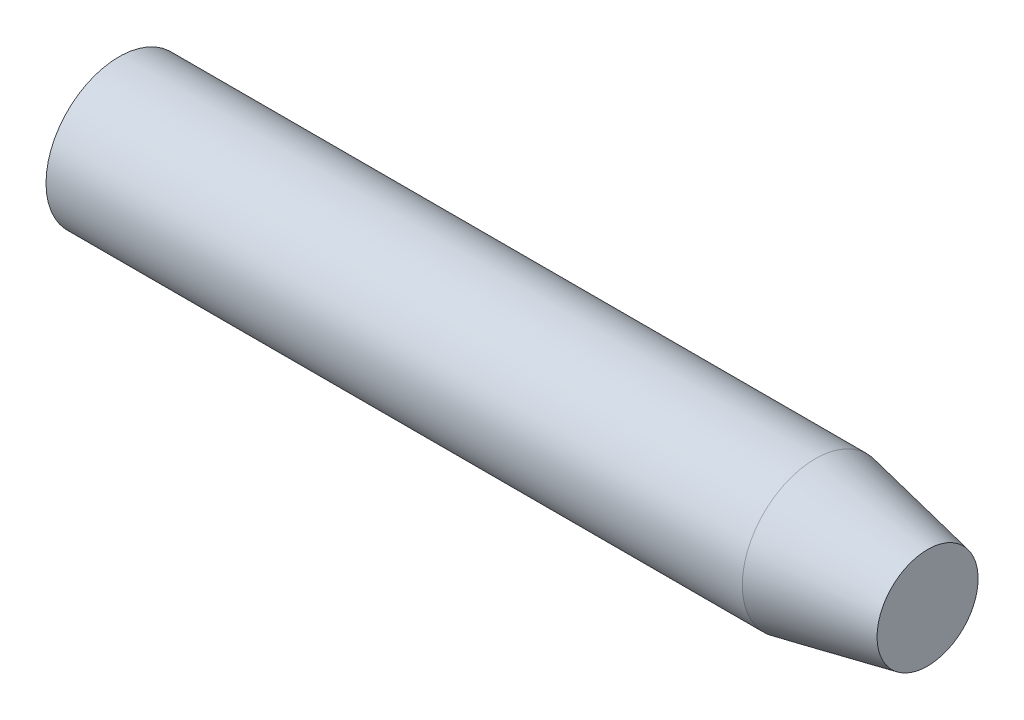
ISO-10303-21;
HEADER;
FILE_DESCRIPTION(('STEP AP214'),'2;1');
FILE_NAME('part.step','',(''),(''),'','','');
FILE_SCHEMA(('AUTOMOTIVE_DESIGN { 1 0 10303 214 1 1 1 1 }'));
ENDSEC;
DATA;
#1=APPLICATION_CONTEXT('core data for automotive mechanical design processes');
#2=APPLICATION_PROTOCOL_DEFINITION('international standard','automotive_design',2000,#1);
#3=PRODUCT_CONTEXT('',#1,'mechanical');
#4=PRODUCT('Part','Part','',(#3));
#5=PRODUCT_RELATED_PRODUCT_CATEGORY('part','',(#4));
#6=PRODUCT_DEFINITION_FORMATION('','',#4);
#7=PRODUCT_DEFINITION_CONTEXT('part definition',#1,'design');
#8=PRODUCT_DEFINITION('design','',#6,#7);
#9=PRODUCT_DEFINITION_SHAPE('','',#8);
#10=(LENGTH_UNIT() NAMED_UNIT(*) SI_UNIT(.MILLI.,.METRE.));
#11=(NAMED_UNIT(*) PLANE_ANGLE_UNIT() SI_UNIT($,.RADIAN.));
#12=(NAMED_UNIT(*) SI_UNIT($,.STERADIAN.) SOLID_ANGLE_UNIT());
#13=UNCERTAINTY_MEASURE_WITH_UNIT(LENGTH_MEASURE(1.E-05),#10,'distance_accuracy_value','');
#14=(GEOMETRIC_REPRESENTATION_CONTEXT(3) GLOBAL_UNCERTAINTY_ASSIGNED_CONTEXT((#13)) GLOBAL_UNIT_ASSIGNED_CONTEXT((#10,
#11,#12)) REPRESENTATION_CONTEXT('',''));
#15=CARTESIAN_POINT('',(0.,0.,0.));
#16=DIRECTION('',(0.,0.,1.));
#17=DIRECTION('',(1.,0.,0.));
#18=AXIS2_PLACEMENT_3D('',#15,#16,#17);
#19=CARTESIAN_POINT('',(-36.,6.49999999999999,0.));
#20=DIRECTION('',(-1.,0.,0.));
#21=DIRECTION('',(0.,0.,-1.));
#22=AXIS2_PLACEMENT_3D('',#19,#20,#21);
#23=PLANE('',#22);
#24=CARTESIAN_POINT('',(-36.,0.,0.));
#25=DIRECTION('',(-1.,0.,0.));
#26=DIRECTION('',(0.,0.,1.));
#27=AXIS2_PLACEMENT_3D('',#24,#25,#26);
#28=CIRCLE('',#27,4.);
#29=CARTESIAN_POINT('',(-36.,0.,4.));
#30=VERTEX_POINT('',#29);
#31=EDGE_CURVE('E10',#30,#30,#28,.T.);
#32=ORIENTED_EDGE('',*,*,#31,.F.);
#33=EDGE_LOOP('',(#32));
#34=FACE_BOUND('',#33,.T.);
#35=CARTESIAN_POINT('',(-36.,0.,0.));
#36=DIRECTION('',(-1.,0.,0.));
#37=DIRECTION('',(0.,0.,1.));
#38=AXIS2_PLACEMENT_3D('',#35,#36,#37);
#39=CIRCLE('',#38,6.5);
#40=CARTESIAN_POINT('',(-36.,0.,6.5));
#41=VERTEX_POINT('',#40);
#42=EDGE_CURVE('E54',#41,#41,#39,.T.);
#43=ORIENTED_EDGE('',*,*,#42,.T.);
#44=EDGE_LOOP('',(#43));
#45=FACE_BOUND('',#44,.T.);
#46=ADVANCED_FACE('F35',(#34,#45),#23,.T.);
#47=CARTESIAN_POINT('',(36.,0.,0.));
#48=DIRECTION('',(1.,0.,0.));
#49=DIRECTION('',(0.,0.,1.));
#50=AXIS2_PLACEMENT_3D('',#47,#48,#49);
#51=CYLINDRICAL_SURFACE('',#50,4.);
#52=CARTESIAN_POINT('',(26.,0.,0.));
#53=DIRECTION('',(-1.,0.,0.));
#54=DIRECTION('',(0.,0.,1.));
#55=AXIS2_PLACEMENT_3D('',#52,#53,#54);
#56=CIRCLE('',#55,4.);
#57=CARTESIAN_POINT('',(26.,0.,4.));
#58=VERTEX_POINT('',#57);
#59=EDGE_CURVE('E41',#58,#58,#56,.T.);
#60=ORIENTED_EDGE('',*,*,#59,.F.);
#61=EDGE_LOOP('',(#60));
#62=FACE_BOUND('',#61,.T.);
#63=ORIENTED_EDGE('',*,*,#31,.T.);
#64=EDGE_LOOP('',(#63));
#65=FACE_BOUND('',#64,.T.);
#66=ADVANCED_FACE('F78',(#62,#65),#51,.F.);
#67=CARTESIAN_POINT('',(26.,3.99999999999999,0.));
#68=DIRECTION('',(-1.,0.,0.));
#69=DIRECTION('',(0.,0.,-1.));
#70=AXIS2_PLACEMENT_3D('',#67,#68,#69);
#71=PLANE('',#70);
#72=ORIENTED_EDGE('',*,*,#59,.T.);
#73=EDGE_LOOP('',(#72));
#74=FACE_BOUND('',#73,.T.);
#75=ADVANCED_FACE('F73',(#74),#71,.T.);
#76=CARTESIAN_POINT('',(36.,4.5,0.));
#77=DIRECTION('',(1.,0.,0.));
#78=DIRECTION('',(0.,0.,1.));
#79=AXIS2_PLACEMENT_3D('',#76,#77,#78);
#80=PLANE('',#79);
#81=CARTESIAN_POINT('',(36.,0.,0.));
#82=DIRECTION('',(-1.,0.,0.));
#83=DIRECTION('',(0.,0.,1.));
#84=AXIS2_PLACEMENT_3D('',#81,#82,#83);
#85=CIRCLE('',#84,4.50000000000001);
#86=CARTESIAN_POINT('',(36.,0.,4.50000000000001));
#87=VERTEX_POINT('',#86);
#88=EDGE_CURVE('E45',#87,#87,#85,.T.);
#89=ORIENTED_EDGE('',*,*,#88,.F.);
#90=EDGE_LOOP('',(#89));
#91=FACE_BOUND('',#90,.T.);
#92=ADVANCED_FACE('F68',(#91),#80,.T.);
#93=CARTESIAN_POINT('',(36.,0.,0.));
#94=DIRECTION('',(-1.,0.,0.));
#95=DIRECTION('',(0.,0.,-1.));
#96=AXIS2_PLACEMENT_3D('',#93,#94,#95);
#97=CONICAL_SURFACE('',#96,4.50000000000001,0.19739555984988);
#98=CARTESIAN_POINT('',(26.,0.,0.));
#99=DIRECTION('',(-1.,0.,0.));
#100=DIRECTION('',(0.,0.,1.));
#101=AXIS2_PLACEMENT_3D('',#98,#99,#100);
#102=CIRCLE('',#101,6.5);
#103=CARTESIAN_POINT('',(26.,0.,6.5));
#104=VERTEX_POINT('',#103);
#105=EDGE_CURVE('E49',#104,#104,#102,.T.);
#106=ORIENTED_EDGE('',*,*,#105,.F.);
#107=EDGE_LOOP('',(#106));
#108=FACE_BOUND('',#107,.T.);
#109=ORIENTED_EDGE('',*,*,#88,.T.);
#110=EDGE_LOOP('',(#109));
#111=FACE_BOUND('',#110,.T.);
#112=ADVANCED_FACE('F62',(#108,#111),#97,.T.);
#113=CARTESIAN_POINT('',(36.,0.,0.));
#114=DIRECTION('',(1.,0.,0.));
#115=DIRECTION('',(0.,0.,1.));
#116=AXIS2_PLACEMENT_3D('',#113,#114,#115);
#117=CYLINDRICAL_SURFACE('',#116,6.5);
#118=ORIENTED_EDGE('',*,*,#42,.F.);
#119=EDGE_LOOP('',(#118));
#120=FACE_BOUND('',#119,.T.);
#121=ORIENTED_EDGE('',*,*,#105,.T.);
#122=EDGE_LOOP('',(#121));
#123=FACE_BOUND('',#122,.T.);
#124=ADVANCED_FACE('F59',(#120,#123),#117,.T.);
#125=CLOSED_SHELL('',(#46,#66,#75,#92,#112,#124));
#126=MANIFOLD_SOLID_BREP('B2',#125);
#127=ADVANCED_BREP_SHAPE_REPRESENTATION('',(#18,#126),#14);
#128=SHAPE_DEFINITION_REPRESENTATION(#9,#127);
ENDSEC;
END-ISO-10303-21;
